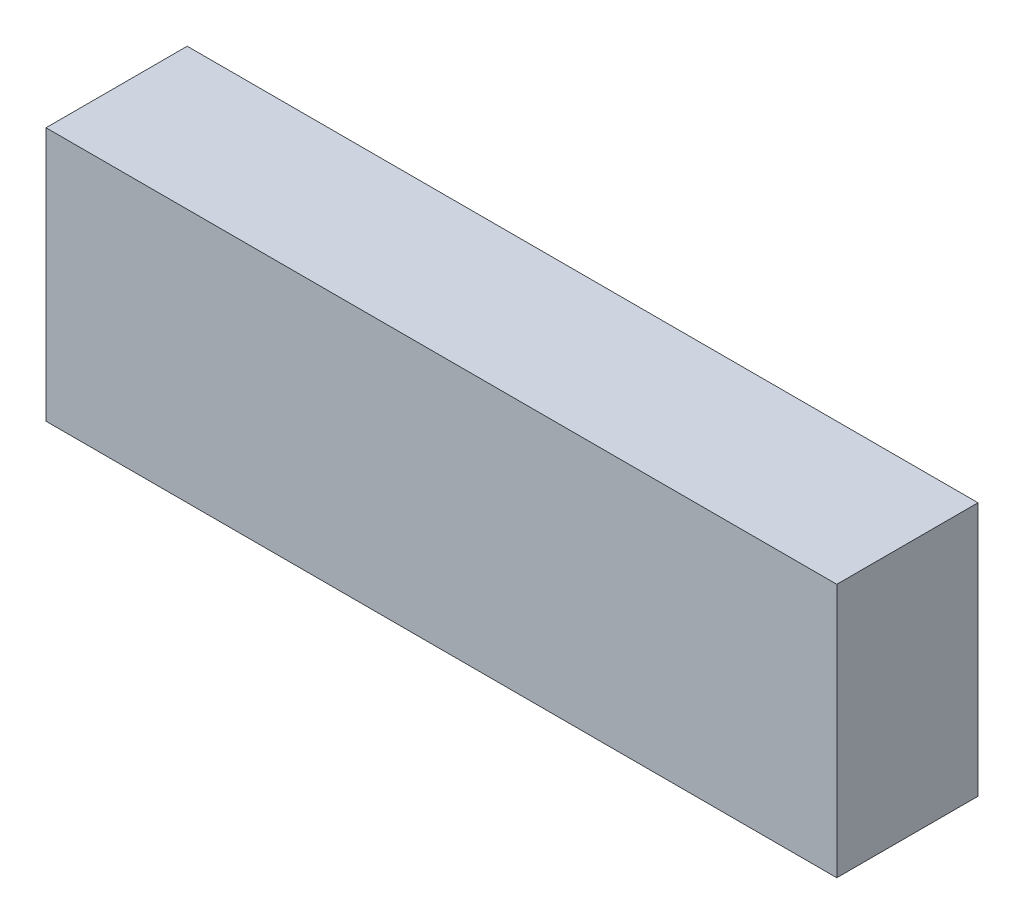
ISO-10303-21;
HEADER;
FILE_DESCRIPTION(('STEP AP214'),'2;1');
FILE_NAME('part.step','',(''),(''),'','','');
FILE_SCHEMA(('AUTOMOTIVE_DESIGN { 1 0 10303 214 1 1 1 1 }'));
ENDSEC;
DATA;
#1=APPLICATION_CONTEXT('core data for automotive mechanical design processes');
#2=APPLICATION_PROTOCOL_DEFINITION('international standard','automotive_design',2000,#1);
#3=PRODUCT_CONTEXT('',#1,'mechanical');
#4=PRODUCT('Part','Part','',(#3));
#5=PRODUCT_RELATED_PRODUCT_CATEGORY('part','',(#4));
#6=PRODUCT_DEFINITION_FORMATION('','',#4);
#7=PRODUCT_DEFINITION_CONTEXT('part definition',#1,'design');
#8=PRODUCT_DEFINITION('design','',#6,#7);
#9=PRODUCT_DEFINITION_SHAPE('','',#8);
#10=(LENGTH_UNIT() NAMED_UNIT(*) SI_UNIT(.MILLI.,.METRE.));
#11=(NAMED_UNIT(*) PLANE_ANGLE_UNIT() SI_UNIT($,.RADIAN.));
#12=(NAMED_UNIT(*) SI_UNIT($,.STERADIAN.) SOLID_ANGLE_UNIT());
#13=UNCERTAINTY_MEASURE_WITH_UNIT(LENGTH_MEASURE(1.E-05),#10,'distance_accuracy_value','');
#14=(GEOMETRIC_REPRESENTATION_CONTEXT(3) GLOBAL_UNCERTAINTY_ASSIGNED_CONTEXT((#13)) GLOBAL_UNIT_ASSIGNED_CONTEXT((#10,
#11,#12)) REPRESENTATION_CONTEXT('',''));
#15=CARTESIAN_POINT('',(0.,0.,0.));
#16=DIRECTION('',(0.,0.,1.));
#17=DIRECTION('',(1.,0.,0.));
#18=AXIS2_PLACEMENT_3D('',#15,#16,#17);
#19=CARTESIAN_POINT('',(0.,0.,25.));
#20=DIRECTION('',(1.,0.,0.));
#21=DIRECTION('',(0.,0.,-1.));
#22=AXIS2_PLACEMENT_3D('',#19,#20,#21);
#23=PLANE('',#22);
#24=DIRECTION('',(0.,-1.,0.));
#25=VECTOR('',#24,1.);
#26=CARTESIAN_POINT('',(0.,0.,0.));
#27=LINE('',#26,#25);
#28=CARTESIAN_POINT('',(0.,45.,0.));
#29=VERTEX_POINT('',#28);
#30=CARTESIAN_POINT('',(0.,0.,0.));
#31=VERTEX_POINT('',#30);
#32=EDGE_CURVE('E96',#29,#31,#27,.T.);
#33=ORIENTED_EDGE('',*,*,#32,.T.);
#34=DIRECTION('',(0.,0.,-1.));
#35=VECTOR('',#34,1.);
#36=CARTESIAN_POINT('',(0.,0.,25.));
#37=LINE('',#36,#35);
#38=CARTESIAN_POINT('',(0.,0.,25.));
#39=VERTEX_POINT('',#38);
#40=EDGE_CURVE('E11',#39,#31,#37,.T.);
#41=ORIENTED_EDGE('',*,*,#40,.F.);
#42=DIRECTION('',(0.,-1.,0.));
#43=VECTOR('',#42,1.);
#44=CARTESIAN_POINT('',(0.,0.,25.));
#45=LINE('',#44,#43);
#46=CARTESIAN_POINT('',(0.,45.,25.));
#47=VERTEX_POINT('',#46);
#48=EDGE_CURVE('E84',#47,#39,#45,.T.);
#49=ORIENTED_EDGE('',*,*,#48,.F.);
#50=DIRECTION('',(0.,0.,-1.));
#51=VECTOR('',#50,1.);
#52=CARTESIAN_POINT('',(0.,45.,25.));
#53=LINE('',#52,#51);
#54=EDGE_CURVE('E92',#47,#29,#53,.T.);
#55=ORIENTED_EDGE('',*,*,#54,.T.);
#56=EDGE_LOOP('',(#33,#41,#49,#55));
#57=FACE_BOUND('',#56,.T.);
#58=ADVANCED_FACE('F33',(#57),#23,.F.);
#59=CARTESIAN_POINT('',(0.,0.,25.));
#60=DIRECTION('',(0.,1.,0.));
#61=DIRECTION('',(0.,0.,1.));
#62=AXIS2_PLACEMENT_3D('',#59,#60,#61);
#63=PLANE('',#62);
#64=DIRECTION('',(1.,0.,0.));
#65=VECTOR('',#64,1.);
#66=CARTESIAN_POINT('',(0.,0.,0.));
#67=LINE('',#66,#65);
#68=CARTESIAN_POINT('',(140.,0.,0.));
#69=VERTEX_POINT('',#68);
#70=EDGE_CURVE('E88',#31,#69,#67,.T.);
#71=ORIENTED_EDGE('',*,*,#70,.T.);
#72=DIRECTION('',(0.,0.,-1.));
#73=VECTOR('',#72,1.);
#74=CARTESIAN_POINT('',(140.,0.,25.));
#75=LINE('',#74,#73);
#76=CARTESIAN_POINT('',(140.,0.,25.));
#77=VERTEX_POINT('',#76);
#78=EDGE_CURVE('E41',#77,#69,#75,.T.);
#79=ORIENTED_EDGE('',*,*,#78,.F.);
#80=DIRECTION('',(1.,0.,0.));
#81=VECTOR('',#80,1.);
#82=CARTESIAN_POINT('',(0.,0.,25.));
#83=LINE('',#82,#81);
#84=EDGE_CURVE('E79',#39,#77,#83,.T.);
#85=ORIENTED_EDGE('',*,*,#84,.F.);
#86=ORIENTED_EDGE('',*,*,#40,.T.);
#87=EDGE_LOOP('',(#71,#79,#85,#86));
#88=FACE_BOUND('',#87,.T.);
#89=ADVANCED_FACE('F87',(#88),#63,.F.);
#90=CARTESIAN_POINT('',(140.,0.,25.));
#91=DIRECTION('',(-1.,0.,0.));
#92=DIRECTION('',(0.,0.,1.));
#93=AXIS2_PLACEMENT_3D('',#90,#91,#92);
#94=PLANE('',#93);
#95=DIRECTION('',(0.,1.,0.));
#96=VECTOR('',#95,1.);
#97=CARTESIAN_POINT('',(140.,0.,0.));
#98=LINE('',#97,#96);
#99=CARTESIAN_POINT('',(140.,45.,0.));
#100=VERTEX_POINT('',#99);
#101=EDGE_CURVE('E66',#69,#100,#98,.T.);
#102=ORIENTED_EDGE('',*,*,#101,.T.);
#103=DIRECTION('',(0.,0.,-1.));
#104=VECTOR('',#103,1.);
#105=CARTESIAN_POINT('',(140.,45.,25.));
#106=LINE('',#105,#104);
#107=CARTESIAN_POINT('',(140.,45.,25.));
#108=VERTEX_POINT('',#107);
#109=EDGE_CURVE('E89',#108,#100,#106,.T.);
#110=ORIENTED_EDGE('',*,*,#109,.F.);
#111=DIRECTION('',(0.,1.,0.));
#112=VECTOR('',#111,1.);
#113=CARTESIAN_POINT('',(140.,0.,25.));
#114=LINE('',#113,#112);
#115=EDGE_CURVE('E82',#77,#108,#114,.T.);
#116=ORIENTED_EDGE('',*,*,#115,.F.);
#117=ORIENTED_EDGE('',*,*,#78,.T.);
#118=EDGE_LOOP('',(#102,#110,#116,#117));
#119=FACE_BOUND('',#118,.T.);
#120=ADVANCED_FACE('F90',(#119),#94,.F.);
#121=CARTESIAN_POINT('',(0.,45.,25.));
#122=DIRECTION('',(0.,-1.,0.));
#123=DIRECTION('',(0.,0.,-1.));
#124=AXIS2_PLACEMENT_3D('',#121,#122,#123);
#125=PLANE('',#124);
#126=DIRECTION('',(-1.,0.,0.));
#127=VECTOR('',#126,1.);
#128=CARTESIAN_POINT('',(0.,45.,0.));
#129=LINE('',#128,#127);
#130=EDGE_CURVE('E72',#100,#29,#129,.T.);
#131=ORIENTED_EDGE('',*,*,#130,.T.);
#132=ORIENTED_EDGE('',*,*,#54,.F.);
#133=DIRECTION('',(-1.,0.,0.));
#134=VECTOR('',#133,1.);
#135=CARTESIAN_POINT('',(0.,45.,25.));
#136=LINE('',#135,#134);
#137=EDGE_CURVE('E49',#108,#47,#136,.T.);
#138=ORIENTED_EDGE('',*,*,#137,.F.);
#139=ORIENTED_EDGE('',*,*,#109,.T.);
#140=EDGE_LOOP('',(#131,#132,#138,#139));
#141=FACE_BOUND('',#140,.T.);
#142=ADVANCED_FACE('F103',(#141),#125,.F.);
#143=CARTESIAN_POINT('',(0.,45.,25.));
#144=DIRECTION('',(0.,0.,-1.));
#145=DIRECTION('',(-1.,0.,0.));
#146=AXIS2_PLACEMENT_3D('',#143,#144,#145);
#147=PLANE('',#146);
#148=ORIENTED_EDGE('',*,*,#48,.T.);
#149=ORIENTED_EDGE('',*,*,#84,.T.);
#150=ORIENTED_EDGE('',*,*,#115,.T.);
#151=ORIENTED_EDGE('',*,*,#137,.T.);
#152=EDGE_LOOP('',(#148,#149,#150,#151));
#153=FACE_BOUND('',#152,.T.);
#154=ADVANCED_FACE('F80',(#153),#147,.F.);
#155=CARTESIAN_POINT('',(0.,45.,0.));
#156=DIRECTION('',(0.,0.,-1.));
#157=DIRECTION('',(-1.,0.,0.));
#158=AXIS2_PLACEMENT_3D('',#155,#156,#157);
#159=PLANE('',#158);
#160=ORIENTED_EDGE('',*,*,#32,.F.);
#161=ORIENTED_EDGE('',*,*,#130,.F.);
#162=ORIENTED_EDGE('',*,*,#101,.F.);
#163=ORIENTED_EDGE('',*,*,#70,.F.);
#164=EDGE_LOOP('',(#160,#161,#162,#163));
#165=FACE_BOUND('',#164,.T.);
#166=ADVANCED_FACE('F106',(#165),#159,.T.);
#167=CLOSED_SHELL('',(#58,#89,#120,#142,#154,#166));
#168=MANIFOLD_SOLID_BREP('B2',#167);
#169=ADVANCED_BREP_SHAPE_REPRESENTATION('',(#18,#168),#14);
#170=SHAPE_DEFINITION_REPRESENTATION(#9,#169);
ENDSEC;
END-ISO-10303-21;
